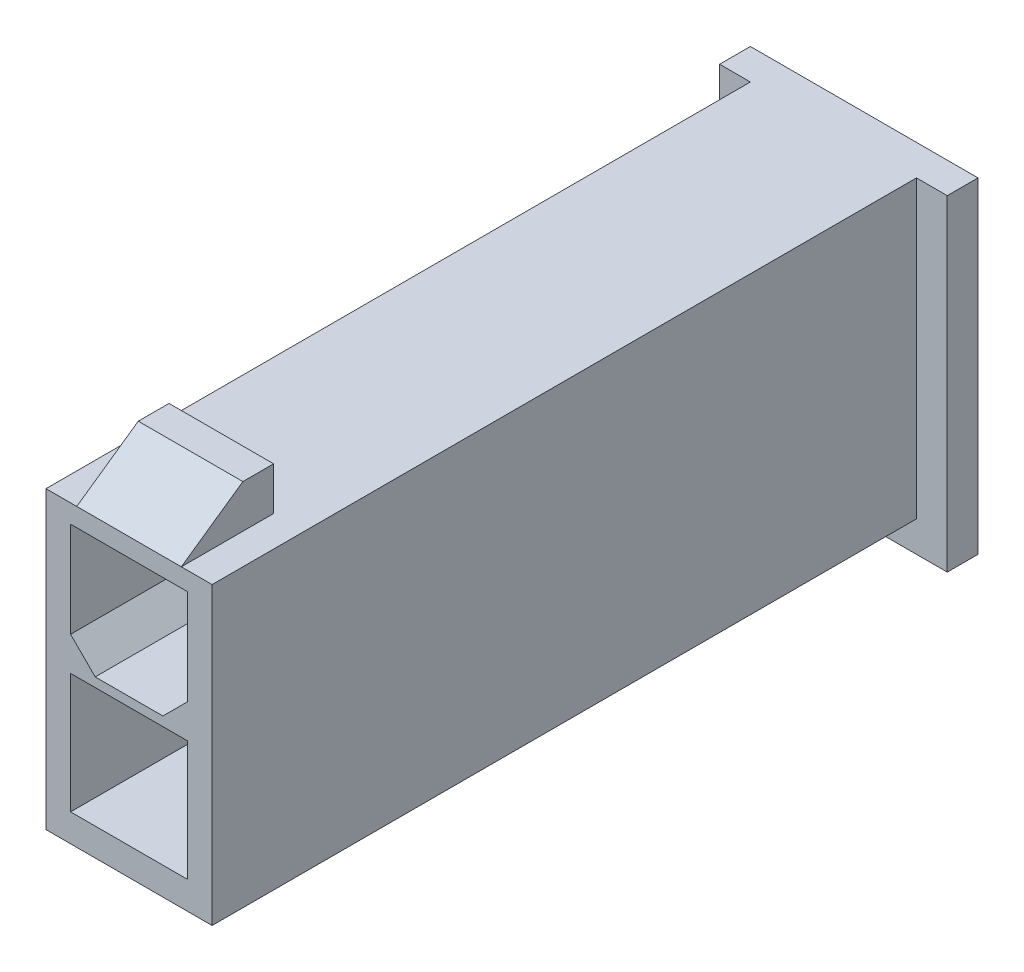
ISO-10303-21;
HEADER;
FILE_DESCRIPTION(('STEP AP214'),'2;1');
FILE_NAME('part.step','',(''),(''),'','','');
FILE_SCHEMA(('AUTOMOTIVE_DESIGN { 1 0 10303 214 1 1 1 1 }'));
ENDSEC;
DATA;
#1=APPLICATION_CONTEXT('core data for automotive mechanical design processes');
#2=APPLICATION_PROTOCOL_DEFINITION('international standard','automotive_design',2000,#1);
#3=PRODUCT_CONTEXT('',#1,'mechanical');
#4=PRODUCT('Part','Part','',(#3));
#5=PRODUCT_RELATED_PRODUCT_CATEGORY('part','',(#4));
#6=PRODUCT_DEFINITION_FORMATION('','',#4);
#7=PRODUCT_DEFINITION_CONTEXT('part definition',#1,'design');
#8=PRODUCT_DEFINITION('design','',#6,#7);
#9=PRODUCT_DEFINITION_SHAPE('','',#8);
#10=(LENGTH_UNIT() NAMED_UNIT(*) SI_UNIT(.MILLI.,.METRE.));
#11=(NAMED_UNIT(*) PLANE_ANGLE_UNIT() SI_UNIT($,.RADIAN.));
#12=(NAMED_UNIT(*) SI_UNIT($,.STERADIAN.) SOLID_ANGLE_UNIT());
#13=UNCERTAINTY_MEASURE_WITH_UNIT(LENGTH_MEASURE(1.E-05),#10,'distance_accuracy_value','');
#14=(GEOMETRIC_REPRESENTATION_CONTEXT(3) GLOBAL_UNCERTAINTY_ASSIGNED_CONTEXT((#13)) GLOBAL_UNIT_ASSIGNED_CONTEXT((#10,
#11,#12)) REPRESENTATION_CONTEXT('',''));
#15=CARTESIAN_POINT('',(0.,0.,0.));
#16=DIRECTION('',(0.,0.,1.));
#17=DIRECTION('',(1.,0.,0.));
#18=AXIS2_PLACEMENT_3D('',#15,#16,#17);
#19=CARTESIAN_POINT('',(-1.7,10.6,-2.99999999999992));
#20=DIRECTION('',(0.,0.,-1.));
#21=DIRECTION('',(0.,-1.,0.));
#22=AXIS2_PLACEMENT_3D('',#19,#20,#21);
#23=PLANE('',#22);
#24=DIRECTION('',(0.,1.,0.));
#25=VECTOR('',#24,1.);
#26=CARTESIAN_POINT('',(-1.7,10.6,-2.99999999999992));
#27=LINE('',#26,#25);
#28=CARTESIAN_POINT('',(-1.7,10.6,-2.99999999999992));
#29=VERTEX_POINT('',#28);
#30=CARTESIAN_POINT('',(-1.7,12.,-3.));
#31=VERTEX_POINT('',#30);
#32=EDGE_CURVE('E415',#29,#31,#27,.T.);
#33=ORIENTED_EDGE('',*,*,#32,.T.);
#34=DIRECTION('',(0.999999999999999,0.,0.));
#35=VECTOR('',#34,1.);
#36=CARTESIAN_POINT('',(-1.7,12.,-3.));
#37=LINE('',#36,#35);
#38=CARTESIAN_POINT('',(1.7,12.,-3.));
#39=VERTEX_POINT('',#38);
#40=EDGE_CURVE('E11',#31,#39,#37,.T.);
#41=ORIENTED_EDGE('',*,*,#40,.T.);
#42=DIRECTION('',(0.,1.,0.));
#43=VECTOR('',#42,1.);
#44=CARTESIAN_POINT('',(1.7,10.6,-2.99999999999992));
#45=LINE('',#44,#43);
#46=CARTESIAN_POINT('',(1.7,10.6,-2.99999999999992));
#47=VERTEX_POINT('',#46);
#48=EDGE_CURVE('E558',#47,#39,#45,.T.);
#49=ORIENTED_EDGE('',*,*,#48,.F.);
#50=DIRECTION('',(0.999999999999999,0.,0.));
#51=VECTOR('',#50,1.);
#52=CARTESIAN_POINT('',(-1.7,10.6,-2.99999999999992));
#53=LINE('',#52,#51);
#54=EDGE_CURVE('E339',#29,#47,#53,.T.);
#55=ORIENTED_EDGE('',*,*,#54,.F.);
#56=EDGE_LOOP('',(#33,#41,#49,#55));
#57=FACE_BOUND('',#56,.T.);
#58=ADVANCED_FACE('F17',(#57),#23,.T.);
#59=CARTESIAN_POINT('',(-1.7,12.,-3.));
#60=DIRECTION('',(0.,1.,0.));
#61=DIRECTION('',(0.999999999999999,0.,0.));
#62=AXIS2_PLACEMENT_3D('',#59,#60,#61);
#63=PLANE('',#62);
#64=DIRECTION('',(0.999999999999999,0.,0.));
#65=VECTOR('',#64,1.);
#66=CARTESIAN_POINT('',(-1.7,12.,-2.));
#67=LINE('',#66,#65);
#68=CARTESIAN_POINT('',(-1.7,12.,-2.));
#69=VERTEX_POINT('',#68);
#70=CARTESIAN_POINT('',(1.7,12.,-2.));
#71=VERTEX_POINT('',#70);
#72=EDGE_CURVE('E482',#69,#71,#67,.T.);
#73=ORIENTED_EDGE('',*,*,#72,.T.);
#74=DIRECTION('',(0.,0.,1.));
#75=VECTOR('',#74,1.);
#76=CARTESIAN_POINT('',(1.7,12.,-3.));
#77=LINE('',#76,#75);
#78=EDGE_CURVE('E29',#39,#71,#77,.T.);
#79=ORIENTED_EDGE('',*,*,#78,.F.);
#80=ORIENTED_EDGE('',*,*,#40,.F.);
#81=DIRECTION('',(0.,0.,1.));
#82=VECTOR('',#81,1.);
#83=CARTESIAN_POINT('',(-1.7,12.,-3.));
#84=LINE('',#83,#82);
#85=EDGE_CURVE('E524',#31,#69,#84,.T.);
#86=ORIENTED_EDGE('',*,*,#85,.T.);
#87=EDGE_LOOP('',(#73,#79,#80,#86));
#88=FACE_BOUND('',#87,.T.);
#89=ADVANCED_FACE('F792',(#88),#63,.T.);
#90=CARTESIAN_POINT('',(1.7,0.,0.));
#91=DIRECTION('',(0.999999999999999,0.,0.));
#92=DIRECTION('',(0.,1.,0.));
#93=AXIS2_PLACEMENT_3D('',#90,#91,#92);
#94=PLANE('',#93);
#95=ORIENTED_EDGE('',*,*,#48,.T.);
#96=ORIENTED_EDGE('',*,*,#78,.T.);
#97=DIRECTION('',(0.,-0.573462344363328,0.819231920519041));
#98=VECTOR('',#97,1.);
#99=CARTESIAN_POINT('',(1.7,12.,-2.));
#100=LINE('',#99,#98);
#101=CARTESIAN_POINT('',(1.7,10.6,0.));
#102=VERTEX_POINT('',#101);
#103=EDGE_CURVE('E477',#71,#102,#100,.T.);
#104=ORIENTED_EDGE('',*,*,#103,.T.);
#105=DIRECTION('',(0.,0.,-1.));
#106=VECTOR('',#105,1.);
#107=CARTESIAN_POINT('',(1.7,10.6,0.));
#108=LINE('',#107,#106);
#109=EDGE_CURVE('E334',#102,#47,#108,.T.);
#110=ORIENTED_EDGE('',*,*,#109,.T.);
#111=EDGE_LOOP('',(#95,#96,#104,#110));
#112=FACE_BOUND('',#111,.T.);
#113=ADVANCED_FACE('F655',(#112),#94,.T.);
#114=CARTESIAN_POINT('',(1.9,6.90000000000001,0.));
#115=DIRECTION('',(0.999999999999999,0.,0.));
#116=DIRECTION('',(0.,1.,0.));
#117=AXIS2_PLACEMENT_3D('',#114,#115,#116);
#118=PLANE('',#117);
#119=DIRECTION('',(0.,0.,-1.));
#120=VECTOR('',#119,1.);
#121=CARTESIAN_POINT('',(1.9,6.90000000000001,0.));
#122=LINE('',#121,#120);
#123=CARTESIAN_POINT('',(1.9,6.90000000000001,0.));
#124=VERTEX_POINT('',#123);
#125=CARTESIAN_POINT('',(1.9,6.90000000000001,-23.7799999999999));
#126=VERTEX_POINT('',#125);
#127=EDGE_CURVE('E494',#124,#126,#122,.T.);
#128=ORIENTED_EDGE('',*,*,#127,.F.);
#129=DIRECTION('',(0.,1.,0.));
#130=VECTOR('',#129,1.);
#131=CARTESIAN_POINT('',(1.9,6.90000000000001,0.));
#132=LINE('',#131,#130);
#133=CARTESIAN_POINT('',(1.9,10.,0.));
#134=VERTEX_POINT('',#133);
#135=EDGE_CURVE('E354',#124,#134,#132,.T.);
#136=ORIENTED_EDGE('',*,*,#135,.T.);
#137=DIRECTION('',(0.,0.,-1.));
#138=VECTOR('',#137,1.);
#139=CARTESIAN_POINT('',(1.9,10.,0.));
#140=LINE('',#139,#138);
#141=CARTESIAN_POINT('',(1.9,10.,-23.7799999999999));
#142=VERTEX_POINT('',#141);
#143=EDGE_CURVE('E556',#134,#142,#140,.T.);
#144=ORIENTED_EDGE('',*,*,#143,.T.);
#145=DIRECTION('',(0.,1.,0.));
#146=VECTOR('',#145,1.);
#147=CARTESIAN_POINT('',(1.9,6.90000000000001,-23.7799999999999));
#148=LINE('',#147,#146);
#149=EDGE_CURVE('E510',#126,#142,#148,.T.);
#150=ORIENTED_EDGE('',*,*,#149,.F.);
#151=EDGE_LOOP('',(#128,#136,#144,#150));
#152=FACE_BOUND('',#151,.T.);
#153=ADVANCED_FACE('F764',(#152),#118,.F.);
#154=CARTESIAN_POINT('',(1.9,10.,0.));
#155=DIRECTION('',(0.,1.,0.));
#156=DIRECTION('',(0.999999999999999,0.,0.));
#157=AXIS2_PLACEMENT_3D('',#154,#155,#156);
#158=PLANE('',#157);
#159=ORIENTED_EDGE('',*,*,#143,.F.);
#160=DIRECTION('',(-0.999999999999999,0.,0.));
#161=VECTOR('',#160,1.);
#162=CARTESIAN_POINT('',(1.9,10.,0.));
#163=LINE('',#162,#161);
#164=CARTESIAN_POINT('',(-1.9,10.,0.));
#165=VERTEX_POINT('',#164);
#166=EDGE_CURVE('E359',#134,#165,#163,.T.);
#167=ORIENTED_EDGE('',*,*,#166,.T.);
#168=DIRECTION('',(0.,0.,-1.));
#169=VECTOR('',#168,1.);
#170=CARTESIAN_POINT('',(-1.9,10.,0.));
#171=LINE('',#170,#169);
#172=CARTESIAN_POINT('',(-1.9,10.,-23.7799999999999));
#173=VERTEX_POINT('',#172);
#174=EDGE_CURVE('E560',#165,#173,#171,.T.);
#175=ORIENTED_EDGE('',*,*,#174,.T.);
#176=DIRECTION('',(-0.999999999999999,0.,0.));
#177=VECTOR('',#176,1.);
#178=CARTESIAN_POINT('',(1.9,10.,-23.7799999999999));
#179=LINE('',#178,#177);
#180=EDGE_CURVE('E445',#142,#173,#179,.T.);
#181=ORIENTED_EDGE('',*,*,#180,.F.);
#182=EDGE_LOOP('',(#159,#167,#175,#181));
#183=FACE_BOUND('',#182,.T.);
#184=ADVANCED_FACE('F781',(#183),#158,.F.);
#185=CARTESIAN_POINT('',(-1.9,10.,0.));
#186=DIRECTION('',(-0.999999999999999,0.,0.));
#187=DIRECTION('',(0.,0.,1.));
#188=AXIS2_PLACEMENT_3D('',#185,#186,#187);
#189=PLANE('',#188);
#190=ORIENTED_EDGE('',*,*,#174,.F.);
#191=DIRECTION('',(0.,-1.,0.));
#192=VECTOR('',#191,1.);
#193=CARTESIAN_POINT('',(-1.9,10.,0.));
#194=LINE('',#193,#192);
#195=CARTESIAN_POINT('',(-1.9,6.90000000000001,0.));
#196=VERTEX_POINT('',#195);
#197=EDGE_CURVE('E484',#165,#196,#194,.T.);
#198=ORIENTED_EDGE('',*,*,#197,.T.);
#199=DIRECTION('',(0.,0.,-1.));
#200=VECTOR('',#199,1.);
#201=CARTESIAN_POINT('',(-1.9,6.90000000000001,0.));
#202=LINE('',#201,#200);
#203=CARTESIAN_POINT('',(-1.9,6.90000000000001,-23.7799999999999));
#204=VERTEX_POINT('',#203);
#205=EDGE_CURVE('E396',#196,#204,#202,.T.);
#206=ORIENTED_EDGE('',*,*,#205,.T.);
#207=DIRECTION('',(0.,-1.,0.));
#208=VECTOR('',#207,1.);
#209=CARTESIAN_POINT('',(-1.9,10.,-23.7799999999999));
#210=LINE('',#209,#208);
#211=EDGE_CURVE('E427',#173,#204,#210,.T.);
#212=ORIENTED_EDGE('',*,*,#211,.F.);
#213=EDGE_LOOP('',(#190,#198,#206,#212));
#214=FACE_BOUND('',#213,.T.);
#215=ADVANCED_FACE('F778',(#214),#189,.F.);
#216=CARTESIAN_POINT('',(-1.9,6.90000000000001,0.));
#217=DIRECTION('',(-0.707106781186547,-0.707106781186549,0.));
#218=DIRECTION('',(-0.707106781186547,0.707106781186549,0.));
#219=AXIS2_PLACEMENT_3D('',#216,#217,#218);
#220=PLANE('',#219);
#221=DIRECTION('',(0.707106781186547,-0.707106781186549,0.));
#222=VECTOR('',#221,1.);
#223=CARTESIAN_POINT('',(-1.9,6.90000000000001,0.));
#224=LINE('',#223,#222);
#225=CARTESIAN_POINT('',(-1.1,6.10000000000002,0.));
#226=VERTEX_POINT('',#225);
#227=EDGE_CURVE('E405',#196,#226,#224,.T.);
#228=ORIENTED_EDGE('',*,*,#227,.T.);
#229=DIRECTION('',(0.,0.,-1.));
#230=VECTOR('',#229,1.);
#231=CARTESIAN_POINT('',(-1.1,6.10000000000002,0.));
#232=LINE('',#231,#230);
#233=CARTESIAN_POINT('',(-1.1,6.10000000000002,-23.9));
#234=VERTEX_POINT('',#233);
#235=EDGE_CURVE('E394',#226,#234,#232,.T.);
#236=ORIENTED_EDGE('',*,*,#235,.T.);
#237=DIRECTION('',(-0.539163866017205,0.539163866017207,0.646996639220607));
#238=VECTOR('',#237,1.);
#239=CARTESIAN_POINT('',(-1.1,6.10000000000002,-23.9));
#240=LINE('',#239,#238);
#241=CARTESIAN_POINT('',(-1.55,6.55000000000002,-23.3599999999999));
#242=VERTEX_POINT('',#241);
#243=EDGE_CURVE('E495',#234,#242,#240,.T.);
#244=ORIENTED_EDGE('',*,*,#243,.T.);
#245=DIRECTION('',(-0.539163866017205,0.539163866017207,-0.646996639220608));
#246=VECTOR('',#245,1.);
#247=CARTESIAN_POINT('',(-1.55,6.55000000000002,-23.3599999999999));
#248=LINE('',#247,#246);
#249=EDGE_CURVE('E424',#242,#204,#248,.T.);
#250=ORIENTED_EDGE('',*,*,#249,.T.);
#251=ORIENTED_EDGE('',*,*,#205,.F.);
#252=EDGE_LOOP('',(#228,#236,#244,#250,#251));
#253=FACE_BOUND('',#252,.T.);
#254=ADVANCED_FACE('F760',(#253),#220,.F.);
#255=CARTESIAN_POINT('',(-1.1,6.10000000000002,0.));
#256=DIRECTION('',(0.,-1.,0.));
#257=DIRECTION('',(0.,0.,-1.));
#258=AXIS2_PLACEMENT_3D('',#255,#256,#257);
#259=PLANE('',#258);
#260=DIRECTION('',(0.999999999999999,0.,0.));
#261=VECTOR('',#260,1.);
#262=CARTESIAN_POINT('',(-1.1,6.10000000000002,0.));
#263=LINE('',#262,#261);
#264=CARTESIAN_POINT('',(1.1,6.10000000000002,0.));
#265=VERTEX_POINT('',#264);
#266=EDGE_CURVE('E400',#226,#265,#263,.T.);
#267=ORIENTED_EDGE('',*,*,#266,.T.);
#268=DIRECTION('',(0.,0.,-1.));
#269=VECTOR('',#268,1.);
#270=CARTESIAN_POINT('',(1.1,6.10000000000002,0.));
#271=LINE('',#270,#269);
#272=CARTESIAN_POINT('',(1.1,6.10000000000002,-23.9));
#273=VERTEX_POINT('',#272);
#274=EDGE_CURVE('E324',#265,#273,#271,.T.);
#275=ORIENTED_EDGE('',*,*,#274,.T.);
#276=DIRECTION('',(0.999999999999999,0.,0.));
#277=VECTOR('',#276,1.);
#278=CARTESIAN_POINT('',(-1.1,6.10000000000002,-23.9));
#279=LINE('',#278,#277);
#280=EDGE_CURVE('E343',#234,#273,#279,.T.);
#281=ORIENTED_EDGE('',*,*,#280,.F.);
#282=ORIENTED_EDGE('',*,*,#235,.F.);
#283=EDGE_LOOP('',(#267,#275,#281,#282));
#284=FACE_BOUND('',#283,.T.);
#285=ADVANCED_FACE('F738',(#284),#259,.F.);
#286=CARTESIAN_POINT('',(1.1,6.10000000000002,0.));
#287=DIRECTION('',(0.707106781186547,-0.707106781186549,0.));
#288=DIRECTION('',(0.,0.,-1.));
#289=AXIS2_PLACEMENT_3D('',#286,#287,#288);
#290=PLANE('',#289);
#291=DIRECTION('',(0.707106781186547,0.707106781186549,0.));
#292=VECTOR('',#291,1.);
#293=CARTESIAN_POINT('',(1.1,6.10000000000002,0.));
#294=LINE('',#293,#292);
#295=EDGE_CURVE('E357',#265,#124,#294,.T.);
#296=ORIENTED_EDGE('',*,*,#295,.T.);
#297=ORIENTED_EDGE('',*,*,#127,.T.);
#298=DIRECTION('',(0.539163866017205,0.539163866017207,-0.646996639220607));
#299=VECTOR('',#298,1.);
#300=CARTESIAN_POINT('',(1.55,6.55000000000002,-23.3599999999999));
#301=LINE('',#300,#299);
#302=CARTESIAN_POINT('',(1.55,6.55000000000002,-23.3599999999999));
#303=VERTEX_POINT('',#302);
#304=EDGE_CURVE('E519',#303,#126,#301,.T.);
#305=ORIENTED_EDGE('',*,*,#304,.F.);
#306=DIRECTION('',(0.539163866017205,0.539163866017207,0.646996639220607));
#307=VECTOR('',#306,1.);
#308=CARTESIAN_POINT('',(1.1,6.10000000000002,-23.9));
#309=LINE('',#308,#307);
#310=EDGE_CURVE('E173',#273,#303,#309,.T.);
#311=ORIENTED_EDGE('',*,*,#310,.F.);
#312=ORIENTED_EDGE('',*,*,#274,.F.);
#313=EDGE_LOOP('',(#296,#297,#305,#311,#312));
#314=FACE_BOUND('',#313,.T.);
#315=ADVANCED_FACE('F743',(#314),#290,.F.);
#316=CARTESIAN_POINT('',(0.,6.35,-23.6));
#317=DIRECTION('',(0.,-0.768221279597377,0.64018439966448));
#318=DIRECTION('',(-0.999999999999999,0.,0.));
#319=AXIS2_PLACEMENT_3D('',#316,#317,#318);
#320=PLANE('',#319);
#321=ORIENTED_EDGE('',*,*,#243,.F.);
#322=DIRECTION('',(-0.999999999999999,0.,0.));
#323=VECTOR('',#322,1.);
#324=CARTESIAN_POINT('',(-1.1,6.10000000000002,-23.9));
#325=LINE('',#324,#323);
#326=CARTESIAN_POINT('',(-2.,6.10000000000002,-23.9));
#327=VERTEX_POINT('',#326);
#328=EDGE_CURVE('E338',#234,#327,#325,.T.);
#329=ORIENTED_EDGE('',*,*,#328,.T.);
#330=DIRECTION('',(-0.539163866017205,-0.539163866017207,-0.646996639220607));
#331=VECTOR('',#330,1.);
#332=CARTESIAN_POINT('',(-1.55,6.55000000000002,-23.3599999999999));
#333=LINE('',#332,#331);
#334=EDGE_CURVE('E428',#242,#327,#333,.T.);
#335=ORIENTED_EDGE('',*,*,#334,.F.);
#336=EDGE_LOOP('',(#321,#329,#335));
#337=FACE_BOUND('',#336,.T.);
#338=ADVANCED_FACE('F754',(#337),#320,.F.);
#339=CARTESIAN_POINT('',(0.,6.35,-23.6));
#340=DIRECTION('',(0.,-0.768221279597377,0.64018439966448));
#341=DIRECTION('',(-0.999999999999999,0.,0.));
#342=AXIS2_PLACEMENT_3D('',#339,#340,#341);
#343=PLANE('',#342);
#344=ORIENTED_EDGE('',*,*,#310,.T.);
#345=DIRECTION('',(0.539163866017205,-0.539163866017207,-0.646996639220607));
#346=VECTOR('',#345,1.);
#347=CARTESIAN_POINT('',(1.55,6.55000000000002,-23.3599999999999));
#348=LINE('',#347,#346);
#349=CARTESIAN_POINT('',(2.,6.10000000000001,-23.9));
#350=VERTEX_POINT('',#349);
#351=EDGE_CURVE('E387',#303,#350,#348,.T.);
#352=ORIENTED_EDGE('',*,*,#351,.T.);
#353=DIRECTION('',(-0.999999999999999,0.,0.));
#354=VECTOR('',#353,1.);
#355=CARTESIAN_POINT('',(2.,6.10000000000001,-23.9));
#356=LINE('',#355,#354);
#357=EDGE_CURVE('E348',#350,#273,#356,.T.);
#358=ORIENTED_EDGE('',*,*,#357,.T.);
#359=EDGE_LOOP('',(#344,#352,#358));
#360=FACE_BOUND('',#359,.T.);
#361=ADVANCED_FACE('F748',(#360),#343,.F.);
#362=CARTESIAN_POINT('',(-1.75,8.10000000000001,-23.6));
#363=DIRECTION('',(-0.768221279597375,0.,0.64018439966448));
#364=DIRECTION('',(0.,1.,0.));
#365=AXIS2_PLACEMENT_3D('',#362,#363,#364);
#366=PLANE('',#365);
#367=DIRECTION('',(-0.539163866017205,0.539163866017207,-0.646996639220608));
#368=VECTOR('',#367,1.);
#369=CARTESIAN_POINT('',(-1.9,10.,-23.7799999999999));
#370=LINE('',#369,#368);
#371=CARTESIAN_POINT('',(-2.,10.1,-23.9));
#372=VERTEX_POINT('',#371);
#373=EDGE_CURVE('E446',#173,#372,#370,.T.);
#374=ORIENTED_EDGE('',*,*,#373,.F.);
#375=ORIENTED_EDGE('',*,*,#211,.T.);
#376=ORIENTED_EDGE('',*,*,#249,.F.);
#377=ORIENTED_EDGE('',*,*,#334,.T.);
#378=DIRECTION('',(0.,1.,0.));
#379=VECTOR('',#378,1.);
#380=CARTESIAN_POINT('',(-2.,6.10000000000002,-23.9));
#381=LINE('',#380,#379);
#382=EDGE_CURVE('E342',#327,#372,#381,.T.);
#383=ORIENTED_EDGE('',*,*,#382,.T.);
#384=EDGE_LOOP('',(#374,#375,#376,#377,#383));
#385=FACE_BOUND('',#384,.T.);
#386=ADVANCED_FACE('F776',(#385),#366,.F.);
#387=CARTESIAN_POINT('',(0.,9.85000000000002,-23.5999999999999));
#388=DIRECTION('',(0.,0.768221279597377,0.64018439966448));
#389=DIRECTION('',(0.999999999999999,0.,0.));
#390=AXIS2_PLACEMENT_3D('',#387,#388,#389);
#391=PLANE('',#390);
#392=DIRECTION('',(0.539163866017205,0.539163866017207,-0.646996639220607));
#393=VECTOR('',#392,1.);
#394=CARTESIAN_POINT('',(1.9,10.,-23.7799999999999));
#395=LINE('',#394,#393);
#396=CARTESIAN_POINT('',(2.,10.1,-23.9));
#397=VERTEX_POINT('',#396);
#398=EDGE_CURVE('E447',#142,#397,#395,.T.);
#399=ORIENTED_EDGE('',*,*,#398,.F.);
#400=ORIENTED_EDGE('',*,*,#180,.T.);
#401=ORIENTED_EDGE('',*,*,#373,.T.);
#402=DIRECTION('',(0.999999999999999,0.,0.));
#403=VECTOR('',#402,1.);
#404=CARTESIAN_POINT('',(-2.,10.1,-23.9));
#405=LINE('',#404,#403);
#406=EDGE_CURVE('E487',#372,#397,#405,.T.);
#407=ORIENTED_EDGE('',*,*,#406,.T.);
#408=EDGE_LOOP('',(#399,#400,#401,#407));
#409=FACE_BOUND('',#408,.T.);
#410=ADVANCED_FACE('F774',(#409),#391,.F.);
#411=CARTESIAN_POINT('',(1.75,8.10000000000001,-23.6));
#412=DIRECTION('',(0.768221279597375,0.,0.64018439966448));
#413=DIRECTION('',(0.,-1.,0.));
#414=AXIS2_PLACEMENT_3D('',#411,#412,#413);
#415=PLANE('',#414);
#416=ORIENTED_EDGE('',*,*,#351,.F.);
#417=ORIENTED_EDGE('',*,*,#304,.T.);
#418=ORIENTED_EDGE('',*,*,#149,.T.);
#419=ORIENTED_EDGE('',*,*,#398,.T.);
#420=DIRECTION('',(0.,-1.,0.));
#421=VECTOR('',#420,1.);
#422=CARTESIAN_POINT('',(2.,10.1,-23.9));
#423=LINE('',#422,#421);
#424=EDGE_CURVE('E366',#397,#350,#423,.T.);
#425=ORIENTED_EDGE('',*,*,#424,.T.);
#426=EDGE_LOOP('',(#416,#417,#418,#419,#425));
#427=FACE_BOUND('',#426,.T.);
#428=ADVANCED_FACE('F769',(#427),#415,.F.);
#429=CARTESIAN_POINT('',(-1.9,1.90000000000001,0.));
#430=DIRECTION('',(0.,-1.,0.));
#431=DIRECTION('',(0.,0.,-1.));
#432=AXIS2_PLACEMENT_3D('',#429,#430,#431);
#433=PLANE('',#432);
#434=DIRECTION('',(0.999999999999999,0.,0.));
#435=VECTOR('',#434,1.);
#436=CARTESIAN_POINT('',(-1.9,1.90000000000001,0.));
#437=LINE('',#436,#435);
#438=CARTESIAN_POINT('',(-1.9,1.90000000000001,0.));
#439=VERTEX_POINT('',#438);
#440=CARTESIAN_POINT('',(1.9,1.9,0.));
#441=VERTEX_POINT('',#440);
#442=EDGE_CURVE('E21',#439,#441,#437,.T.);
#443=ORIENTED_EDGE('',*,*,#442,.T.);
#444=DIRECTION('',(0.,0.,-1.));
#445=VECTOR('',#444,1.);
#446=CARTESIAN_POINT('',(1.9,1.9,0.));
#447=LINE('',#446,#445);
#448=CARTESIAN_POINT('',(1.9,1.9,-23.9));
#449=VERTEX_POINT('',#448);
#450=EDGE_CURVE('E451',#441,#449,#447,.T.);
#451=ORIENTED_EDGE('',*,*,#450,.T.);
#452=DIRECTION('',(0.999999999999999,0.,0.));
#453=VECTOR('',#452,1.);
#454=CARTESIAN_POINT('',(-1.9,1.90000000000001,-23.9));
#455=LINE('',#454,#453);
#456=CARTESIAN_POINT('',(-1.9,1.90000000000001,-23.9));
#457=VERTEX_POINT('',#456);
#458=EDGE_CURVE('E353',#457,#449,#455,.T.);
#459=ORIENTED_EDGE('',*,*,#458,.F.);
#460=DIRECTION('',(0.,0.,-1.));
#461=VECTOR('',#460,1.);
#462=CARTESIAN_POINT('',(-1.9,1.90000000000001,0.));
#463=LINE('',#462,#461);
#464=EDGE_CURVE('E382',#439,#457,#463,.T.);
#465=ORIENTED_EDGE('',*,*,#464,.F.);
#466=EDGE_LOOP('',(#443,#451,#459,#465));
#467=FACE_BOUND('',#466,.T.);
#468=ADVANCED_FACE('F828',(#467),#433,.F.);
#469=CARTESIAN_POINT('',(-1.9,5.80000000000001,0.));
#470=DIRECTION('',(-0.999999999999999,0.,0.));
#471=DIRECTION('',(0.,0.,1.));
#472=AXIS2_PLACEMENT_3D('',#469,#470,#471);
#473=PLANE('',#472);
#474=DIRECTION('',(0.,0.,-1.));
#475=VECTOR('',#474,1.);
#476=CARTESIAN_POINT('',(-1.9,5.80000000000001,0.));
#477=LINE('',#476,#475);
#478=CARTESIAN_POINT('',(-1.9,5.80000000000001,0.));
#479=VERTEX_POINT('',#478);
#480=CARTESIAN_POINT('',(-1.9,5.80000000000001,-23.7));
#481=VERTEX_POINT('',#480);
#482=EDGE_CURVE('E390',#479,#481,#477,.T.);
#483=ORIENTED_EDGE('',*,*,#482,.F.);
#484=DIRECTION('',(0.,-1.,0.));
#485=VECTOR('',#484,1.);
#486=CARTESIAN_POINT('',(-1.9,5.80000000000001,0.));
#487=LINE('',#486,#485);
#488=EDGE_CURVE('E452',#479,#439,#487,.T.);
#489=ORIENTED_EDGE('',*,*,#488,.T.);
#490=ORIENTED_EDGE('',*,*,#464,.T.);
#491=DIRECTION('',(0.,-0.447213595499919,-0.894427190999937));
#492=VECTOR('',#491,1.);
#493=CARTESIAN_POINT('',(-1.9,2.00000000000001,-23.6999999999999));
#494=LINE('',#493,#492);
#495=CARTESIAN_POINT('',(-1.9,2.00000000000001,-23.6999999999999));
#496=VERTEX_POINT('',#495);
#497=EDGE_CURVE('E182',#496,#457,#494,.T.);
#498=ORIENTED_EDGE('',*,*,#497,.F.);
#499=DIRECTION('',(0.,-1.,0.));
#500=VECTOR('',#499,1.);
#501=CARTESIAN_POINT('',(-1.9,5.80000000000001,-23.7));
#502=LINE('',#501,#500);
#503=EDGE_CURVE('E420',#481,#496,#502,.T.);
#504=ORIENTED_EDGE('',*,*,#503,.F.);
#505=EDGE_LOOP('',(#483,#489,#490,#498,#504));
#506=FACE_BOUND('',#505,.T.);
#507=ADVANCED_FACE('F19',(#506),#473,.F.);
#508=CARTESIAN_POINT('',(1.9,5.80000000000001,0.));
#509=DIRECTION('',(0.,1.,0.));
#510=DIRECTION('',(0.999999999999999,0.,0.));
#511=AXIS2_PLACEMENT_3D('',#508,#509,#510);
#512=PLANE('',#511);
#513=DIRECTION('',(0.,0.,-1.));
#514=VECTOR('',#513,1.);
#515=CARTESIAN_POINT('',(1.9,5.80000000000001,0.));
#516=LINE('',#515,#514);
#517=CARTESIAN_POINT('',(1.9,5.80000000000001,0.));
#518=VERTEX_POINT('',#517);
#519=CARTESIAN_POINT('',(1.9,5.80000000000001,-23.7));
#520=VERTEX_POINT('',#519);
#521=EDGE_CURVE('E449',#518,#520,#516,.T.);
#522=ORIENTED_EDGE('',*,*,#521,.F.);
#523=DIRECTION('',(-0.999999999999999,0.,0.));
#524=VECTOR('',#523,1.);
#525=CARTESIAN_POINT('',(1.9,5.80000000000001,0.));
#526=LINE('',#525,#524);
#527=EDGE_CURVE('E541',#518,#479,#526,.T.);
#528=ORIENTED_EDGE('',*,*,#527,.T.);
#529=ORIENTED_EDGE('',*,*,#482,.T.);
#530=DIRECTION('',(-0.999999999999999,0.,0.));
#531=VECTOR('',#530,1.);
#532=CARTESIAN_POINT('',(1.9,5.80000000000001,-23.7));
#533=LINE('',#532,#531);
#534=EDGE_CURVE('E378',#520,#481,#533,.T.);
#535=ORIENTED_EDGE('',*,*,#534,.F.);
#536=EDGE_LOOP('',(#522,#528,#529,#535));
#537=FACE_BOUND('',#536,.T.);
#538=ADVANCED_FACE('F818',(#537),#512,.F.);
#539=CARTESIAN_POINT('',(1.9,1.9,0.));
#540=DIRECTION('',(0.999999999999999,0.,0.));
#541=DIRECTION('',(0.,1.,0.));
#542=AXIS2_PLACEMENT_3D('',#539,#540,#541);
#543=PLANE('',#542);
#544=DIRECTION('',(0.,-0.447213595499919,-0.894427190999937));
#545=VECTOR('',#544,1.);
#546=CARTESIAN_POINT('',(1.9,2.,-23.6999999999999));
#547=LINE('',#546,#545);
#548=CARTESIAN_POINT('',(1.9,2.,-23.6999999999999));
#549=VERTEX_POINT('',#548);
#550=EDGE_CURVE('E574',#549,#449,#547,.T.);
#551=ORIENTED_EDGE('',*,*,#550,.T.);
#552=ORIENTED_EDGE('',*,*,#450,.F.);
#553=DIRECTION('',(0.,1.,0.));
#554=VECTOR('',#553,1.);
#555=CARTESIAN_POINT('',(1.9,1.9,0.));
#556=LINE('',#555,#554);
#557=EDGE_CURVE('E540',#441,#518,#556,.T.);
#558=ORIENTED_EDGE('',*,*,#557,.T.);
#559=ORIENTED_EDGE('',*,*,#521,.T.);
#560=DIRECTION('',(0.,1.,0.));
#561=VECTOR('',#560,1.);
#562=CARTESIAN_POINT('',(1.9,2.,-23.6999999999999));
#563=LINE('',#562,#561);
#564=EDGE_CURVE('E373',#549,#520,#563,.T.);
#565=ORIENTED_EDGE('',*,*,#564,.F.);
#566=EDGE_LOOP('',(#551,#552,#558,#559,#565));
#567=FACE_BOUND('',#566,.T.);
#568=ADVANCED_FACE('F821',(#567),#543,.F.);
#569=CARTESIAN_POINT('',(0.,2.15000000000001,-23.4));
#570=DIRECTION('',(0.,-0.894427190999897,0.447213595499998));
#571=DIRECTION('',(-0.999999999999999,0.,0.));
#572=AXIS2_PLACEMENT_3D('',#569,#570,#571);
#573=PLANE('',#572);
#574=ORIENTED_EDGE('',*,*,#497,.T.);
#575=DIRECTION('',(-0.999999999999999,0.,0.));
#576=VECTOR('',#575,1.);
#577=CARTESIAN_POINT('',(-1.9,1.90000000000001,-23.9));
#578=LINE('',#577,#576);
#579=CARTESIAN_POINT('',(-2.,1.90000000000001,-23.9));
#580=VERTEX_POINT('',#579);
#581=EDGE_CURVE('E364',#457,#580,#578,.T.);
#582=ORIENTED_EDGE('',*,*,#581,.T.);
#583=DIRECTION('',(-0.408248290463896,-0.408248290463897,-0.816496580927693));
#584=VECTOR('',#583,1.);
#585=CARTESIAN_POINT('',(-1.9,2.00000000000001,-23.6999999999999));
#586=LINE('',#585,#584);
#587=EDGE_CURVE('E425',#496,#580,#586,.T.);
#588=ORIENTED_EDGE('',*,*,#587,.F.);
#589=EDGE_LOOP('',(#574,#582,#588));
#590=FACE_BOUND('',#589,.T.);
#591=ADVANCED_FACE('F812',(#590),#573,.F.);
#592=CARTESIAN_POINT('',(0.,2.15000000000001,-23.4));
#593=DIRECTION('',(0.,-0.894427190999897,0.447213595499998));
#594=DIRECTION('',(-0.999999999999999,0.,0.));
#595=AXIS2_PLACEMENT_3D('',#592,#593,#594);
#596=PLANE('',#595);
#597=ORIENTED_EDGE('',*,*,#550,.F.);
#598=DIRECTION('',(0.408248290463896,-0.408248290463897,-0.816496580927693));
#599=VECTOR('',#598,1.);
#600=CARTESIAN_POINT('',(1.9,2.,-23.6999999999999));
#601=LINE('',#600,#599);
#602=CARTESIAN_POINT('',(2.,1.9,-23.9));
#603=VERTEX_POINT('',#602);
#604=EDGE_CURVE('E375',#549,#603,#601,.T.);
#605=ORIENTED_EDGE('',*,*,#604,.T.);
#606=DIRECTION('',(-0.999999999999999,0.,0.));
#607=VECTOR('',#606,1.);
#608=CARTESIAN_POINT('',(2.,1.9,-23.9));
#609=LINE('',#608,#607);
#610=EDGE_CURVE('E347',#603,#449,#609,.T.);
#611=ORIENTED_EDGE('',*,*,#610,.T.);
#612=EDGE_LOOP('',(#597,#605,#611));
#613=FACE_BOUND('',#612,.T.);
#614=ADVANCED_FACE('F807',(#613),#596,.F.);
#615=CARTESIAN_POINT('',(-1.75,3.90000000000001,-23.4));
#616=DIRECTION('',(-0.894427190999895,0.,0.447213595499998));
#617=DIRECTION('',(0.,1.,0.));
#618=AXIS2_PLACEMENT_3D('',#615,#616,#617);
#619=PLANE('',#618);
#620=DIRECTION('',(-0.408248290463896,0.408248290463897,-0.816496580927694));
#621=VECTOR('',#620,1.);
#622=CARTESIAN_POINT('',(-1.9,5.80000000000001,-23.7));
#623=LINE('',#622,#621);
#624=CARTESIAN_POINT('',(-2.,5.90000000000001,-23.9));
#625=VERTEX_POINT('',#624);
#626=EDGE_CURVE('E385',#481,#625,#623,.T.);
#627=ORIENTED_EDGE('',*,*,#626,.F.);
#628=ORIENTED_EDGE('',*,*,#503,.T.);
#629=ORIENTED_EDGE('',*,*,#587,.T.);
#630=DIRECTION('',(0.,1.,0.));
#631=VECTOR('',#630,1.);
#632=CARTESIAN_POINT('',(-2.,1.90000000000001,-23.9));
#633=LINE('',#632,#631);
#634=EDGE_CURVE('E363',#580,#625,#633,.T.);
#635=ORIENTED_EDGE('',*,*,#634,.T.);
#636=EDGE_LOOP('',(#627,#628,#629,#635));
#637=FACE_BOUND('',#636,.T.);
#638=ADVANCED_FACE('F813',(#637),#619,.F.);
#639=CARTESIAN_POINT('',(0.,5.65000000000001,-23.4));
#640=DIRECTION('',(0.,0.894427190999897,0.447213595499998));
#641=DIRECTION('',(0.999999999999999,0.,0.));
#642=AXIS2_PLACEMENT_3D('',#639,#640,#641);
#643=PLANE('',#642);
#644=DIRECTION('',(0.408248290463896,0.408248290463897,-0.816496580927694));
#645=VECTOR('',#644,1.);
#646=CARTESIAN_POINT('',(1.9,5.80000000000001,-23.7));
#647=LINE('',#646,#645);
#648=CARTESIAN_POINT('',(2.,5.90000000000001,-23.9));
#649=VERTEX_POINT('',#648);
#650=EDGE_CURVE('E380',#520,#649,#647,.T.);
#651=ORIENTED_EDGE('',*,*,#650,.F.);
#652=ORIENTED_EDGE('',*,*,#534,.T.);
#653=ORIENTED_EDGE('',*,*,#626,.T.);
#654=DIRECTION('',(0.999999999999999,0.,0.));
#655=VECTOR('',#654,1.);
#656=CARTESIAN_POINT('',(-2.,5.90000000000001,-23.9));
#657=LINE('',#656,#655);
#658=EDGE_CURVE('E300',#625,#649,#657,.T.);
#659=ORIENTED_EDGE('',*,*,#658,.T.);
#660=EDGE_LOOP('',(#651,#652,#653,#659));
#661=FACE_BOUND('',#660,.T.);
#662=ADVANCED_FACE('F595',(#661),#643,.F.);
#663=CARTESIAN_POINT('',(1.75,3.9,-23.4));
#664=DIRECTION('',(0.894427190999895,0.,0.447213595499998));
#665=DIRECTION('',(0.,-1.,0.));
#666=AXIS2_PLACEMENT_3D('',#663,#664,#665);
#667=PLANE('',#666);
#668=ORIENTED_EDGE('',*,*,#604,.F.);
#669=ORIENTED_EDGE('',*,*,#564,.T.);
#670=ORIENTED_EDGE('',*,*,#650,.T.);
#671=DIRECTION('',(0.,-1.,0.));
#672=VECTOR('',#671,1.);
#673=CARTESIAN_POINT('',(2.,5.90000000000001,-23.9));
#674=LINE('',#673,#672);
#675=EDGE_CURVE('E352',#649,#603,#674,.T.);
#676=ORIENTED_EDGE('',*,*,#675,.T.);
#677=EDGE_LOOP('',(#668,#669,#670,#676));
#678=FACE_BOUND('',#677,.T.);
#679=ADVANCED_FACE('F601',(#678),#667,.F.);
#680=CARTESIAN_POINT('',(-3.7,0.,-23.8999999999999));
#681=DIRECTION('',(-0.999999999999999,0.,0.));
#682=DIRECTION('',(0.,0.,1.));
#683=AXIS2_PLACEMENT_3D('',#680,#681,#682);
#684=PLANE('',#683);
#685=DIRECTION('',(0.,1.,0.));
#686=VECTOR('',#685,1.);
#687=CARTESIAN_POINT('',(-3.7,0.,-22.9));
#688=LINE('',#687,#686);
#689=CARTESIAN_POINT('',(-3.7,0.,-22.9));
#690=VERTEX_POINT('',#689);
#691=CARTESIAN_POINT('',(-3.7,10.6,-22.9));
#692=VERTEX_POINT('',#691);
#693=EDGE_CURVE('E303',#690,#692,#688,.T.);
#694=ORIENTED_EDGE('',*,*,#693,.T.);
#695=DIRECTION('',(0.,0.,1.));
#696=VECTOR('',#695,1.);
#697=CARTESIAN_POINT('',(-3.7,10.6,-23.9));
#698=LINE('',#697,#696);
#699=CARTESIAN_POINT('',(-3.7,10.6,-23.9));
#700=VERTEX_POINT('',#699);
#701=EDGE_CURVE('E299',#700,#692,#698,.T.);
#702=ORIENTED_EDGE('',*,*,#701,.F.);
#703=DIRECTION('',(0.,1.,0.));
#704=VECTOR('',#703,1.);
#705=CARTESIAN_POINT('',(-3.7,0.,-23.8999999999999));
#706=LINE('',#705,#704);
#707=CARTESIAN_POINT('',(-3.7,0.,-23.8999999999999));
#708=VERTEX_POINT('',#707);
#709=EDGE_CURVE('E286',#708,#700,#706,.T.);
#710=ORIENTED_EDGE('',*,*,#709,.F.);
#711=DIRECTION('',(0.,0.,1.));
#712=VECTOR('',#711,1.);
#713=CARTESIAN_POINT('',(-3.7,0.,-23.8999999999999));
#714=LINE('',#713,#712);
#715=EDGE_CURVE('E417',#708,#690,#714,.T.);
#716=ORIENTED_EDGE('',*,*,#715,.T.);
#717=EDGE_LOOP('',(#694,#702,#710,#716));
#718=FACE_BOUND('',#717,.T.);
#719=ADVANCED_FACE('F301',(#718),#684,.T.);
#720=CARTESIAN_POINT('',(0.,0.,-23.8999999999999));
#721=DIRECTION('',(0.,0.,-1.));
#722=DIRECTION('',(0.,-1.,0.));
#723=AXIS2_PLACEMENT_3D('',#720,#721,#722);
#724=PLANE('',#723);
#725=ORIENTED_EDGE('',*,*,#406,.F.);
#726=ORIENTED_EDGE('',*,*,#382,.F.);
#727=ORIENTED_EDGE('',*,*,#328,.F.);
#728=ORIENTED_EDGE('',*,*,#280,.T.);
#729=ORIENTED_EDGE('',*,*,#357,.F.);
#730=ORIENTED_EDGE('',*,*,#424,.F.);
#731=EDGE_LOOP('',(#725,#726,#727,#728,#729,#730));
#732=FACE_BOUND('',#731,.T.);
#733=ORIENTED_EDGE('',*,*,#658,.F.);
#734=ORIENTED_EDGE('',*,*,#634,.F.);
#735=ORIENTED_EDGE('',*,*,#581,.F.);
#736=ORIENTED_EDGE('',*,*,#458,.T.);
#737=ORIENTED_EDGE('',*,*,#610,.F.);
#738=ORIENTED_EDGE('',*,*,#675,.F.);
#739=EDGE_LOOP('',(#733,#734,#735,#736,#737,#738));
#740=FACE_BOUND('',#739,.T.);
#741=ORIENTED_EDGE('',*,*,#709,.T.);
#742=DIRECTION('',(-0.999999999999999,0.,0.));
#743=VECTOR('',#742,1.);
#744=CARTESIAN_POINT('',(3.7,10.6,-23.9));
#745=LINE('',#744,#743);
#746=CARTESIAN_POINT('',(3.7,10.6,-23.9));
#747=VERTEX_POINT('',#746);
#748=EDGE_CURVE('E295',#747,#700,#745,.T.);
#749=ORIENTED_EDGE('',*,*,#748,.F.);
#750=DIRECTION('',(0.,1.,0.));
#751=VECTOR('',#750,1.);
#752=CARTESIAN_POINT('',(3.7,0.,-23.8999999999999));
#753=LINE('',#752,#751);
#754=CARTESIAN_POINT('',(3.7,0.,-23.8999999999999));
#755=VERTEX_POINT('',#754);
#756=EDGE_CURVE('E416',#755,#747,#753,.T.);
#757=ORIENTED_EDGE('',*,*,#756,.F.);
#758=DIRECTION('',(0.999999999999999,0.,0.));
#759=VECTOR('',#758,1.);
#760=CARTESIAN_POINT('',(-3.7,0.,-23.8999999999999));
#761=LINE('',#760,#759);
#762=EDGE_CURVE('E293',#708,#755,#761,.T.);
#763=ORIENTED_EDGE('',*,*,#762,.F.);
#764=EDGE_LOOP('',(#741,#749,#757,#763));
#765=FACE_BOUND('',#764,.T.);
#766=ADVANCED_FACE('F288',(#732,#740,#765),#724,.T.);
#767=CARTESIAN_POINT('',(-2.7,0.,-22.9));
#768=DIRECTION('',(0.,-1.,0.));
#769=DIRECTION('',(0.,0.,-1.));
#770=AXIS2_PLACEMENT_3D('',#767,#768,#769);
#771=PLANE('',#770);
#772=ORIENTED_EDGE('',*,*,#715,.F.);
#773=ORIENTED_EDGE('',*,*,#762,.T.);
#774=DIRECTION('',(0.,0.,-1.));
#775=VECTOR('',#774,1.);
#776=CARTESIAN_POINT('',(3.7,0.,-22.9));
#777=LINE('',#776,#775);
#778=CARTESIAN_POINT('',(3.7,0.,-22.9));
#779=VERTEX_POINT('',#778);
#780=EDGE_CURVE('E413',#779,#755,#777,.T.);
#781=ORIENTED_EDGE('',*,*,#780,.F.);
#782=DIRECTION('',(-0.999999999999999,0.,0.));
#783=VECTOR('',#782,1.);
#784=CARTESIAN_POINT('',(3.7,0.,-22.9));
#785=LINE('',#784,#783);
#786=EDGE_CURVE('E464',#779,#690,#785,.T.);
#787=ORIENTED_EDGE('',*,*,#786,.T.);
#788=EDGE_LOOP('',(#772,#773,#781,#787));
#789=FACE_BOUND('',#788,.T.);
#790=ADVANCED_FACE('F809',(#789),#771,.T.);
#791=CARTESIAN_POINT('',(3.7,0.,-22.9));
#792=DIRECTION('',(0.999999999999999,0.,0.));
#793=DIRECTION('',(0.,1.,0.));
#794=AXIS2_PLACEMENT_3D('',#791,#792,#793);
#795=PLANE('',#794);
#796=ORIENTED_EDGE('',*,*,#756,.T.);
#797=DIRECTION('',(0.,0.,-1.));
#798=VECTOR('',#797,1.);
#799=CARTESIAN_POINT('',(3.7,10.6,-22.9));
#800=LINE('',#799,#798);
#801=CARTESIAN_POINT('',(3.7,10.6,-22.9));
#802=VERTEX_POINT('',#801);
#803=EDGE_CURVE('E314',#802,#747,#800,.T.);
#804=ORIENTED_EDGE('',*,*,#803,.F.);
#805=DIRECTION('',(0.,1.,0.));
#806=VECTOR('',#805,1.);
#807=CARTESIAN_POINT('',(3.7,0.,-22.9));
#808=LINE('',#807,#806);
#809=EDGE_CURVE('E442',#779,#802,#808,.T.);
#810=ORIENTED_EDGE('',*,*,#809,.F.);
#811=ORIENTED_EDGE('',*,*,#780,.T.);
#812=EDGE_LOOP('',(#796,#804,#810,#811));
#813=FACE_BOUND('',#812,.T.);
#814=ADVANCED_FACE('F467',(#813),#795,.T.);
#815=CARTESIAN_POINT('',(2.7,10.6,0.));
#816=DIRECTION('',(0.999999999999999,0.,0.));
#817=DIRECTION('',(0.,1.,0.));
#818=AXIS2_PLACEMENT_3D('',#815,#816,#817);
#819=PLANE('',#818);
#820=DIRECTION('',(0.,0.,-1.));
#821=VECTOR('',#820,1.);
#822=CARTESIAN_POINT('',(2.7,10.6,0.));
#823=LINE('',#822,#821);
#824=CARTESIAN_POINT('',(2.7,10.6,0.));
#825=VERTEX_POINT('',#824);
#826=CARTESIAN_POINT('',(2.7,10.6,-22.9));
#827=VERTEX_POINT('',#826);
#828=EDGE_CURVE('E337',#825,#827,#823,.T.);
#829=ORIENTED_EDGE('',*,*,#828,.F.);
#830=DIRECTION('',(0.,-1.,0.));
#831=VECTOR('',#830,1.);
#832=CARTESIAN_POINT('',(2.7,10.6,0.));
#833=LINE('',#832,#831);
#834=CARTESIAN_POINT('',(2.7,1.,0.));
#835=VERTEX_POINT('',#834);
#836=EDGE_CURVE('E410',#825,#835,#833,.T.);
#837=ORIENTED_EDGE('',*,*,#836,.T.);
#838=DIRECTION('',(0.,0.,-1.));
#839=VECTOR('',#838,1.);
#840=CARTESIAN_POINT('',(2.7,1.,0.));
#841=LINE('',#840,#839);
#842=CARTESIAN_POINT('',(2.7,0.999999999999994,-22.9000000000001));
#843=VERTEX_POINT('',#842);
#844=EDGE_CURVE('E332',#835,#843,#841,.T.);
#845=ORIENTED_EDGE('',*,*,#844,.T.);
#846=DIRECTION('',(0.,-1.,0.));
#847=VECTOR('',#846,1.);
#848=CARTESIAN_POINT('',(2.7,10.6,-22.9));
#849=LINE('',#848,#847);
#850=EDGE_CURVE('E436',#827,#843,#849,.T.);
#851=ORIENTED_EDGE('',*,*,#850,.F.);
#852=EDGE_LOOP('',(#829,#837,#845,#851));
#853=FACE_BOUND('',#852,.T.);
#854=ADVANCED_FACE('F695',(#853),#819,.T.);
#855=CARTESIAN_POINT('',(-2.7,1.,-12.));
#856=DIRECTION('',(0.,0.,1.));
#857=DIRECTION('',(0.999999999999999,0.,0.));
#858=AXIS2_PLACEMENT_3D('',#855,#856,#857);
#859=PLANE('',#858);
#860=CARTESIAN_POINT('',(0.,1.,-12.));
#861=DIRECTION('',(0.,0.,1.));
#862=DIRECTION('',(-0.999999999999999,0.,0.));
#863=AXIS2_PLACEMENT_3D('',#860,#861,#862);
#864=CIRCLE('',#863,0.4);
#865=CARTESIAN_POINT('',(-0.4,1.,-12.));
#866=VERTEX_POINT('',#865);
#867=CARTESIAN_POINT('',(0.4,1.,-12.));
#868=VERTEX_POINT('',#867);
#869=EDGE_CURVE('E335',#866,#868,#864,.T.);
#870=ORIENTED_EDGE('',*,*,#869,.T.);
#871=DIRECTION('',(0.999999999999999,0.,0.));
#872=VECTOR('',#871,1.);
#873=CARTESIAN_POINT('',(-0.4,1.,-12.));
#874=LINE('',#873,#872);
#875=EDGE_CURVE('E473',#866,#868,#874,.T.);
#876=ORIENTED_EDGE('',*,*,#875,.F.);
#877=EDGE_LOOP('',(#870,#876));
#878=FACE_BOUND('',#877,.T.);
#879=ADVANCED_FACE('F822',(#878),#859,.T.);
#880=CARTESIAN_POINT('',(2.7,1.,0.));
#881=DIRECTION('',(0.,-1.,0.));
#882=DIRECTION('',(0.,0.,-1.));
#883=AXIS2_PLACEMENT_3D('',#880,#881,#882);
#884=PLANE('',#883);
#885=DIRECTION('',(0.,0.,1.));
#886=VECTOR('',#885,1.);
#887=CARTESIAN_POINT('',(0.4,1.,-22.9000000000001));
#888=LINE('',#887,#886);
#889=CARTESIAN_POINT('',(0.4,1.,-22.9000000000001));
#890=VERTEX_POINT('',#889);
#891=EDGE_CURVE('E479',#890,#868,#888,.T.);
#892=ORIENTED_EDGE('',*,*,#891,.F.);
#893=DIRECTION('',(0.999999999999999,0.,0.));
#894=VECTOR('',#893,1.);
#895=CARTESIAN_POINT('',(0.4,1.,-22.9000000000001));
#896=LINE('',#895,#894);
#897=EDGE_CURVE('E439',#890,#843,#896,.T.);
#898=ORIENTED_EDGE('',*,*,#897,.T.);
#899=ORIENTED_EDGE('',*,*,#844,.F.);
#900=DIRECTION('',(-0.999999999999999,0.,0.));
#901=VECTOR('',#900,1.);
#902=CARTESIAN_POINT('',(2.7,1.,0.));
#903=LINE('',#902,#901);
#904=CARTESIAN_POINT('',(-2.7,1.,0.));
#905=VERTEX_POINT('',#904);
#906=EDGE_CURVE('E536',#835,#905,#903,.T.);
#907=ORIENTED_EDGE('',*,*,#906,.T.);
#908=DIRECTION('',(0.,0.,-1.));
#909=VECTOR('',#908,1.);
#910=CARTESIAN_POINT('',(-2.7,1.,0.));
#911=LINE('',#910,#909);
#912=CARTESIAN_POINT('',(-2.7,1.,-22.9000000000001));
#913=VERTEX_POINT('',#912);
#914=EDGE_CURVE('E392',#905,#913,#911,.T.);
#915=ORIENTED_EDGE('',*,*,#914,.T.);
#916=DIRECTION('',(0.999999999999999,0.,0.));
#917=VECTOR('',#916,1.);
#918=CARTESIAN_POINT('',(-2.7,1.,-22.9000000000001));
#919=LINE('',#918,#917);
#920=CARTESIAN_POINT('',(-0.4,1.,-22.9000000000001));
#921=VERTEX_POINT('',#920);
#922=EDGE_CURVE('E628',#913,#921,#919,.T.);
#923=ORIENTED_EDGE('',*,*,#922,.T.);
#924=DIRECTION('',(0.,0.,1.));
#925=VECTOR('',#924,1.);
#926=CARTESIAN_POINT('',(-0.4,1.,-22.9000000000001));
#927=LINE('',#926,#925);
#928=EDGE_CURVE('E330',#921,#866,#927,.T.);
#929=ORIENTED_EDGE('',*,*,#928,.T.);
#930=ORIENTED_EDGE('',*,*,#875,.T.);
#931=EDGE_LOOP('',(#892,#898,#899,#907,#915,#923,#929,#930));
#932=FACE_BOUND('',#931,.T.);
#933=ADVANCED_FACE('F699',(#932),#884,.T.);
#934=CARTESIAN_POINT('',(0.,1.,-22.9000000000001));
#935=DIRECTION('',(0.,0.,1.));
#936=DIRECTION('',(0.999999999999999,0.,0.));
#937=AXIS2_PLACEMENT_3D('',#934,#935,#936);
#938=CYLINDRICAL_SURFACE('',#937,0.4);
#939=CARTESIAN_POINT('',(0.,1.,-22.9000000000001));
#940=DIRECTION('',(0.,0.,1.));
#941=DIRECTION('',(-0.999999999999999,0.,0.));
#942=AXIS2_PLACEMENT_3D('',#939,#940,#941);
#943=CIRCLE('',#942,0.4);
#944=EDGE_CURVE('E561',#921,#890,#943,.T.);
#945=ORIENTED_EDGE('',*,*,#944,.T.);
#946=ORIENTED_EDGE('',*,*,#891,.T.);
#947=ORIENTED_EDGE('',*,*,#869,.F.);
#948=ORIENTED_EDGE('',*,*,#928,.F.);
#949=EDGE_LOOP('',(#945,#946,#947,#948));
#950=FACE_BOUND('',#949,.T.);
#951=ADVANCED_FACE('F801',(#950),#938,.T.);
#952=CARTESIAN_POINT('',(-2.7,1.,-22.9000000000001));
#953=DIRECTION('',(0.,0.,1.));
#954=DIRECTION('',(0.999999999999999,0.,0.));
#955=AXIS2_PLACEMENT_3D('',#952,#953,#954);
#956=PLANE('',#955);
#957=ORIENTED_EDGE('',*,*,#922,.F.);
#958=DIRECTION('',(0.,1.,0.));
#959=VECTOR('',#958,1.);
#960=CARTESIAN_POINT('',(-2.7,1.,-22.9000000000001));
#961=LINE('',#960,#959);
#962=CARTESIAN_POINT('',(-2.7,10.6,-22.9));
#963=VERTEX_POINT('',#962);
#964=EDGE_CURVE('E626',#913,#963,#961,.T.);
#965=ORIENTED_EDGE('',*,*,#964,.T.);
#966=DIRECTION('',(0.999999999999999,0.,0.));
#967=VECTOR('',#966,1.);
#968=CARTESIAN_POINT('',(-3.7,10.6,-22.9));
#969=LINE('',#968,#967);
#970=EDGE_CURVE('E306',#692,#963,#969,.T.);
#971=ORIENTED_EDGE('',*,*,#970,.F.);
#972=ORIENTED_EDGE('',*,*,#693,.F.);
#973=ORIENTED_EDGE('',*,*,#786,.F.);
#974=ORIENTED_EDGE('',*,*,#809,.T.);
#975=DIRECTION('',(0.999999999999999,0.,0.));
#976=VECTOR('',#975,1.);
#977=CARTESIAN_POINT('',(2.7,10.6,-22.9));
#978=LINE('',#977,#976);
#979=EDGE_CURVE('E321',#827,#802,#978,.T.);
#980=ORIENTED_EDGE('',*,*,#979,.F.);
#981=ORIENTED_EDGE('',*,*,#850,.T.);
#982=ORIENTED_EDGE('',*,*,#897,.F.);
#983=ORIENTED_EDGE('',*,*,#944,.F.);
#984=EDGE_LOOP('',(#957,#965,#971,#972,#973,#974,#980,#981,#982,#983));
#985=FACE_BOUND('',#984,.T.);
#986=ADVANCED_FACE('F459',(#985),#956,.T.);
#987=CARTESIAN_POINT('',(-2.7,1.,0.));
#988=DIRECTION('',(-0.999999999999999,0.,0.));
#989=DIRECTION('',(0.,0.,1.));
#990=AXIS2_PLACEMENT_3D('',#987,#988,#989);
#991=PLANE('',#990);
#992=ORIENTED_EDGE('',*,*,#914,.F.);
#993=DIRECTION('',(0.,1.,0.));
#994=VECTOR('',#993,1.);
#995=CARTESIAN_POINT('',(-2.7,1.,0.));
#996=LINE('',#995,#994);
#997=CARTESIAN_POINT('',(-2.7,10.6,0.));
#998=VERTEX_POINT('',#997);
#999=EDGE_CURVE('E547',#905,#998,#996,.T.);
#1000=ORIENTED_EDGE('',*,*,#999,.T.);
#1001=DIRECTION('',(0.,0.,-1.));
#1002=VECTOR('',#1001,1.);
#1003=CARTESIAN_POINT('',(-2.7,10.6,0.));
#1004=LINE('',#1003,#1002);
#1005=EDGE_CURVE('E389',#998,#963,#1004,.T.);
#1006=ORIENTED_EDGE('',*,*,#1005,.T.);
#1007=ORIENTED_EDGE('',*,*,#964,.F.);
#1008=EDGE_LOOP('',(#992,#1000,#1006,#1007));
#1009=FACE_BOUND('',#1008,.T.);
#1010=ADVANCED_FACE('F632',(#1009),#991,.T.);
#1011=CARTESIAN_POINT('',(-2.7,10.6,0.));
#1012=DIRECTION('',(0.,1.,0.));
#1013=DIRECTION('',(0.999999999999999,0.,0.));
#1014=AXIS2_PLACEMENT_3D('',#1011,#1012,#1013);
#1015=PLANE('',#1014);
#1016=ORIENTED_EDGE('',*,*,#54,.T.);
#1017=ORIENTED_EDGE('',*,*,#109,.F.);
#1018=DIRECTION('',(0.999999999999999,0.,0.));
#1019=VECTOR('',#1018,1.);
#1020=CARTESIAN_POINT('',(1.7,10.6,0.));
#1021=LINE('',#1020,#1019);
#1022=EDGE_CURVE('E401',#102,#825,#1021,.T.);
#1023=ORIENTED_EDGE('',*,*,#1022,.T.);
#1024=ORIENTED_EDGE('',*,*,#828,.T.);
#1025=ORIENTED_EDGE('',*,*,#979,.T.);
#1026=ORIENTED_EDGE('',*,*,#803,.T.);
#1027=ORIENTED_EDGE('',*,*,#748,.T.);
#1028=ORIENTED_EDGE('',*,*,#701,.T.);
#1029=ORIENTED_EDGE('',*,*,#970,.T.);
#1030=ORIENTED_EDGE('',*,*,#1005,.F.);
#1031=DIRECTION('',(0.999999999999999,0.,0.));
#1032=VECTOR('',#1031,1.);
#1033=CARTESIAN_POINT('',(-2.7,10.6,0.));
#1034=LINE('',#1033,#1032);
#1035=CARTESIAN_POINT('',(-1.7,10.6,0.));
#1036=VERTEX_POINT('',#1035);
#1037=EDGE_CURVE('E615',#998,#1036,#1034,.T.);
#1038=ORIENTED_EDGE('',*,*,#1037,.T.);
#1039=DIRECTION('',(0.,0.,-1.));
#1040=VECTOR('',#1039,1.);
#1041=CARTESIAN_POINT('',(-1.7,10.6,0.));
#1042=LINE('',#1041,#1040);
#1043=EDGE_CURVE('E407',#1036,#29,#1042,.T.);
#1044=ORIENTED_EDGE('',*,*,#1043,.T.);
#1045=EDGE_LOOP('',(#1016,#1017,#1023,#1024,#1025,#1026,#1027,#1028,#1029,#1030,#1038,#1044));
#1046=FACE_BOUND('',#1045,.T.);
#1047=ADVANCED_FACE('F313',(#1046),#1015,.T.);
#1048=CARTESIAN_POINT('',(-1.7,0.,0.));
#1049=DIRECTION('',(0.999999999999999,0.,0.));
#1050=DIRECTION('',(0.,1.,0.));
#1051=AXIS2_PLACEMENT_3D('',#1048,#1049,#1050);
#1052=PLANE('',#1051);
#1053=DIRECTION('',(0.,-0.573462344363328,0.819231920519041));
#1054=VECTOR('',#1053,1.);
#1055=CARTESIAN_POINT('',(-1.7,12.,-2.));
#1056=LINE('',#1055,#1054);
#1057=EDGE_CURVE('E527',#69,#1036,#1056,.T.);
#1058=ORIENTED_EDGE('',*,*,#1057,.F.);
#1059=ORIENTED_EDGE('',*,*,#85,.F.);
#1060=ORIENTED_EDGE('',*,*,#32,.F.);
#1061=ORIENTED_EDGE('',*,*,#1043,.F.);
#1062=EDGE_LOOP('',(#1058,#1059,#1060,#1061));
#1063=FACE_BOUND('',#1062,.T.);
#1064=ADVANCED_FACE('F650',(#1063),#1052,.F.);
#1065=CARTESIAN_POINT('',(-1.7,12.,-2.));
#1066=DIRECTION('',(0.,0.819231920519042,0.573462344363328));
#1067=DIRECTION('',(0.999999999999999,0.,0.));
#1068=AXIS2_PLACEMENT_3D('',#1065,#1066,#1067);
#1069=PLANE('',#1068);
#1070=ORIENTED_EDGE('',*,*,#103,.F.);
#1071=ORIENTED_EDGE('',*,*,#72,.F.);
#1072=ORIENTED_EDGE('',*,*,#1057,.T.);
#1073=DIRECTION('',(0.999999999999999,0.,0.));
#1074=VECTOR('',#1073,1.);
#1075=CARTESIAN_POINT('',(-1.7,10.6,0.));
#1076=LINE('',#1075,#1074);
#1077=EDGE_CURVE('E406',#1036,#102,#1076,.T.);
#1078=ORIENTED_EDGE('',*,*,#1077,.T.);
#1079=EDGE_LOOP('',(#1070,#1071,#1072,#1078));
#1080=FACE_BOUND('',#1079,.T.);
#1081=ADVANCED_FACE('F833',(#1080),#1069,.T.);
#1082=CARTESIAN_POINT('',(0.,0.,0.));
#1083=DIRECTION('',(0.,0.,-1.));
#1084=DIRECTION('',(0.,-1.,0.));
#1085=AXIS2_PLACEMENT_3D('',#1082,#1083,#1084);
#1086=PLANE('',#1085);
#1087=ORIENTED_EDGE('',*,*,#166,.F.);
#1088=ORIENTED_EDGE('',*,*,#135,.F.);
#1089=ORIENTED_EDGE('',*,*,#295,.F.);
#1090=ORIENTED_EDGE('',*,*,#266,.F.);
#1091=ORIENTED_EDGE('',*,*,#227,.F.);
#1092=ORIENTED_EDGE('',*,*,#197,.F.);
#1093=EDGE_LOOP('',(#1087,#1088,#1089,#1090,#1091,#1092));
#1094=FACE_BOUND('',#1093,.T.);
#1095=ORIENTED_EDGE('',*,*,#527,.F.);
#1096=ORIENTED_EDGE('',*,*,#557,.F.);
#1097=ORIENTED_EDGE('',*,*,#442,.F.);
#1098=ORIENTED_EDGE('',*,*,#488,.F.);
#1099=EDGE_LOOP('',(#1095,#1096,#1097,#1098));
#1100=FACE_BOUND('',#1099,.T.);
#1101=ORIENTED_EDGE('',*,*,#1037,.F.);
#1102=ORIENTED_EDGE('',*,*,#999,.F.);
#1103=ORIENTED_EDGE('',*,*,#906,.F.);
#1104=ORIENTED_EDGE('',*,*,#836,.F.);
#1105=ORIENTED_EDGE('',*,*,#1022,.F.);
#1106=ORIENTED_EDGE('',*,*,#1077,.F.);
#1107=EDGE_LOOP('',(#1101,#1102,#1103,#1104,#1105,#1106));
#1108=FACE_BOUND('',#1107,.T.);
#1109=ADVANCED_FACE('F639',(#1094,#1100,#1108),#1086,.F.);
#1110=CLOSED_SHELL('',(#58,#89,#113,#153,#184,#215,#254,#285,#315,#338,#361,#386,#410,#428,#468,
#507,#538,#568,#591,#614,#638,#662,#679,#719,#766,#790,#814,#854,#879,#933,#951,#986,#1010,
#1047,#1064,#1081,#1109));
#1111=MANIFOLD_SOLID_BREP('B1',#1110);
#1112=ADVANCED_BREP_SHAPE_REPRESENTATION('',(#18,#1111),#14);
#1113=SHAPE_DEFINITION_REPRESENTATION(#9,#1112);
ENDSEC;
END-ISO-10303-21;
